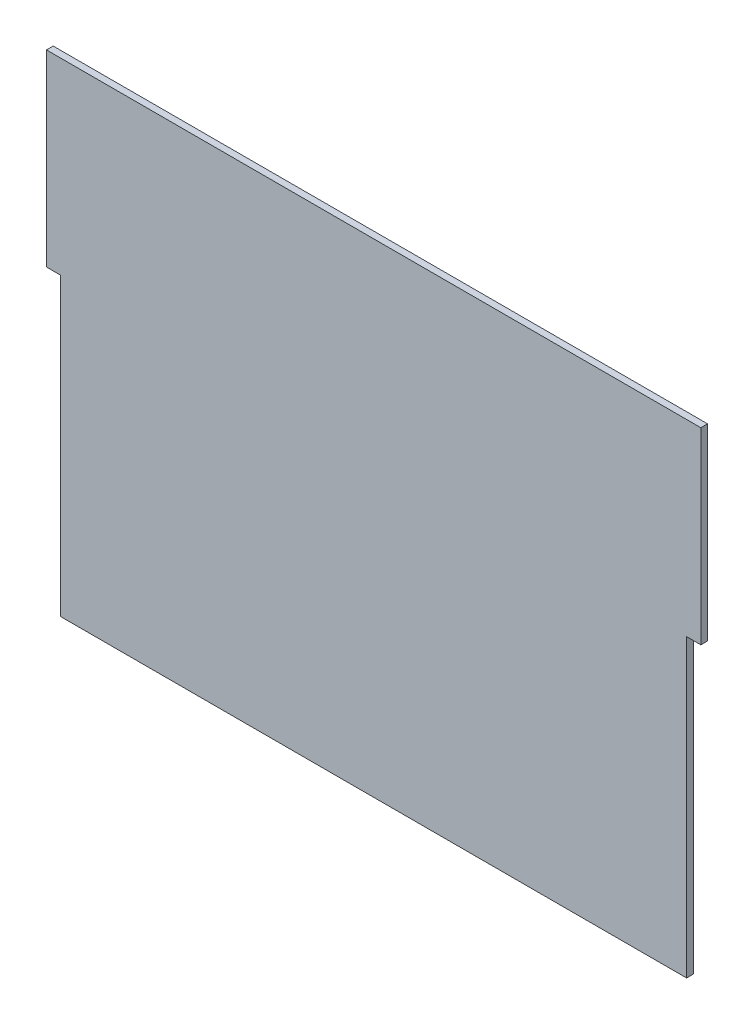
ISO-10303-21;
HEADER;
FILE_DESCRIPTION(('STEP AP214'),'2;1');
FILE_NAME('part.step','',(''),(''),'','','');
FILE_SCHEMA(('AUTOMOTIVE_DESIGN { 1 0 10303 214 1 1 1 1 }'));
ENDSEC;
DATA;
#1=APPLICATION_CONTEXT('core data for automotive mechanical design processes');
#2=APPLICATION_PROTOCOL_DEFINITION('international standard','automotive_design',2000,#1);
#3=PRODUCT_CONTEXT('',#1,'mechanical');
#4=PRODUCT('Part','Part','',(#3));
#5=PRODUCT_RELATED_PRODUCT_CATEGORY('part','',(#4));
#6=PRODUCT_DEFINITION_FORMATION('','',#4);
#7=PRODUCT_DEFINITION_CONTEXT('part definition',#1,'design');
#8=PRODUCT_DEFINITION('design','',#6,#7);
#9=PRODUCT_DEFINITION_SHAPE('','',#8);
#10=(LENGTH_UNIT() NAMED_UNIT(*) SI_UNIT(.MILLI.,.METRE.));
#11=(NAMED_UNIT(*) PLANE_ANGLE_UNIT() SI_UNIT($,.RADIAN.));
#12=(NAMED_UNIT(*) SI_UNIT($,.STERADIAN.) SOLID_ANGLE_UNIT());
#13=UNCERTAINTY_MEASURE_WITH_UNIT(LENGTH_MEASURE(1.E-05),#10,'distance_accuracy_value','');
#14=(GEOMETRIC_REPRESENTATION_CONTEXT(3) GLOBAL_UNCERTAINTY_ASSIGNED_CONTEXT((#13)) GLOBAL_UNIT_ASSIGNED_CONTEXT((#10,
#11,#12)) REPRESENTATION_CONTEXT('',''));
#15=CARTESIAN_POINT('',(0.,0.,0.));
#16=DIRECTION('',(0.,0.,1.));
#17=DIRECTION('',(1.,0.,0.));
#18=AXIS2_PLACEMENT_3D('',#15,#16,#17);
#19=CARTESIAN_POINT('',(139.7,0.,2.9972));
#20=DIRECTION('',(1.,0.,0.));
#21=DIRECTION('',(0.,1.,0.));
#22=AXIS2_PLACEMENT_3D('',#19,#20,#21);
#23=PLANE('',#22);
#24=DIRECTION('',(0.,-1.,0.));
#25=VECTOR('',#24,1.);
#26=CARTESIAN_POINT('',(139.7,0.,0.));
#27=LINE('',#26,#25);
#28=CARTESIAN_POINT('',(139.7,24.003,0.));
#29=VERTEX_POINT('',#28);
#30=CARTESIAN_POINT('',(139.7,-107.95,0.));
#31=VERTEX_POINT('',#30);
#32=EDGE_CURVE('E129',#29,#31,#27,.T.);
#33=ORIENTED_EDGE('',*,*,#32,.F.);
#34=DIRECTION('',(0.,0.,-1.));
#35=VECTOR('',#34,1.);
#36=CARTESIAN_POINT('',(139.7,24.003,2.9972));
#37=LINE('',#36,#35);
#38=CARTESIAN_POINT('',(139.7,24.003,2.9972));
#39=VERTEX_POINT('',#38);
#40=EDGE_CURVE('E11',#39,#29,#37,.T.);
#41=ORIENTED_EDGE('',*,*,#40,.F.);
#42=DIRECTION('',(0.,-1.,0.));
#43=VECTOR('',#42,1.);
#44=CARTESIAN_POINT('',(139.7,0.,2.9972));
#45=LINE('',#44,#43);
#46=CARTESIAN_POINT('',(139.7,-107.95,2.9972));
#47=VERTEX_POINT('',#46);
#48=EDGE_CURVE('E149',#39,#47,#45,.T.);
#49=ORIENTED_EDGE('',*,*,#48,.T.);
#50=DIRECTION('',(0.,0.,-1.));
#51=VECTOR('',#50,1.);
#52=CARTESIAN_POINT('',(139.7,-107.95,2.9972));
#53=LINE('',#52,#51);
#54=EDGE_CURVE('E52',#47,#31,#53,.T.);
#55=ORIENTED_EDGE('',*,*,#54,.T.);
#56=EDGE_LOOP('',(#33,#41,#49,#55));
#57=FACE_BOUND('',#56,.T.);
#58=ADVANCED_FACE('F36',(#57),#23,.T.);
#59=CARTESIAN_POINT('',(0.,24.0030000000001,2.9972));
#60=DIRECTION('',(0.,-1.,0.));
#61=DIRECTION('',(1.,0.,0.));
#62=AXIS2_PLACEMENT_3D('',#59,#60,#61);
#63=PLANE('',#62);
#64=DIRECTION('',(-1.,0.,0.));
#65=VECTOR('',#64,1.);
#66=CARTESIAN_POINT('',(0.,24.0030000000001,0.));
#67=LINE('',#66,#65);
#68=CARTESIAN_POINT('',(146.05,24.003,0.));
#69=VERTEX_POINT('',#68);
#70=EDGE_CURVE('E131',#69,#29,#67,.T.);
#71=ORIENTED_EDGE('',*,*,#70,.F.);
#72=DIRECTION('',(0.,0.,-1.));
#73=VECTOR('',#72,1.);
#74=CARTESIAN_POINT('',(146.05,24.003,2.9972));
#75=LINE('',#74,#73);
#76=CARTESIAN_POINT('',(146.05,24.003,2.9972));
#77=VERTEX_POINT('',#76);
#78=EDGE_CURVE('E44',#77,#69,#75,.T.);
#79=ORIENTED_EDGE('',*,*,#78,.F.);
#80=DIRECTION('',(-1.,0.,0.));
#81=VECTOR('',#80,1.);
#82=CARTESIAN_POINT('',(0.,24.0030000000001,2.9972));
#83=LINE('',#82,#81);
#84=EDGE_CURVE('E175',#77,#39,#83,.T.);
#85=ORIENTED_EDGE('',*,*,#84,.T.);
#86=ORIENTED_EDGE('',*,*,#40,.T.);
#87=EDGE_LOOP('',(#71,#79,#85,#86));
#88=FACE_BOUND('',#87,.T.);
#89=ADVANCED_FACE('F166',(#88),#63,.T.);
#90=CARTESIAN_POINT('',(146.05,0.,2.9972));
#91=DIRECTION('',(1.,0.,0.));
#92=DIRECTION('',(0.,0.,-1.));
#93=AXIS2_PLACEMENT_3D('',#90,#91,#92);
#94=PLANE('',#93);
#95=DIRECTION('',(0.,-1.,0.));
#96=VECTOR('',#95,1.);
#97=CARTESIAN_POINT('',(146.05,0.,0.));
#98=LINE('',#97,#96);
#99=CARTESIAN_POINT('',(146.05,107.95,0.));
#100=VERTEX_POINT('',#99);
#101=EDGE_CURVE('E134',#100,#69,#98,.T.);
#102=ORIENTED_EDGE('',*,*,#101,.F.);
#103=DIRECTION('',(0.,0.,-1.));
#104=VECTOR('',#103,1.);
#105=CARTESIAN_POINT('',(146.05,107.95,2.9972));
#106=LINE('',#105,#104);
#107=CARTESIAN_POINT('',(146.05,107.95,2.9972));
#108=VERTEX_POINT('',#107);
#109=EDGE_CURVE('E155',#108,#100,#106,.T.);
#110=ORIENTED_EDGE('',*,*,#109,.F.);
#111=DIRECTION('',(0.,-1.,0.));
#112=VECTOR('',#111,1.);
#113=CARTESIAN_POINT('',(146.05,0.,2.9972));
#114=LINE('',#113,#112);
#115=EDGE_CURVE('E162',#108,#77,#114,.T.);
#116=ORIENTED_EDGE('',*,*,#115,.T.);
#117=ORIENTED_EDGE('',*,*,#78,.T.);
#118=EDGE_LOOP('',(#102,#110,#116,#117));
#119=FACE_BOUND('',#118,.T.);
#120=ADVANCED_FACE('F160',(#119),#94,.T.);
#121=CARTESIAN_POINT('',(0.,107.95,2.9972));
#122=DIRECTION('',(0.,1.,0.));
#123=DIRECTION('',(-1.,0.,0.));
#124=AXIS2_PLACEMENT_3D('',#121,#122,#123);
#125=PLANE('',#124);
#126=DIRECTION('',(1.,0.,0.));
#127=VECTOR('',#126,1.);
#128=CARTESIAN_POINT('',(0.,107.95,0.));
#129=LINE('',#128,#127);
#130=CARTESIAN_POINT('',(-146.05,107.95,0.));
#131=VERTEX_POINT('',#130);
#132=EDGE_CURVE('E137',#131,#100,#129,.T.);
#133=ORIENTED_EDGE('',*,*,#132,.F.);
#134=DIRECTION('',(0.,0.,-1.));
#135=VECTOR('',#134,1.);
#136=CARTESIAN_POINT('',(-146.05,107.95,2.9972));
#137=LINE('',#136,#135);
#138=CARTESIAN_POINT('',(-146.05,107.95,2.9972));
#139=VERTEX_POINT('',#138);
#140=EDGE_CURVE('E153',#139,#131,#137,.T.);
#141=ORIENTED_EDGE('',*,*,#140,.F.);
#142=DIRECTION('',(1.,0.,0.));
#143=VECTOR('',#142,1.);
#144=CARTESIAN_POINT('',(0.,107.95,2.9972));
#145=LINE('',#144,#143);
#146=EDGE_CURVE('E174',#139,#108,#145,.T.);
#147=ORIENTED_EDGE('',*,*,#146,.T.);
#148=ORIENTED_EDGE('',*,*,#109,.T.);
#149=EDGE_LOOP('',(#133,#141,#147,#148));
#150=FACE_BOUND('',#149,.T.);
#151=ADVANCED_FACE('F172',(#150),#125,.T.);
#152=CARTESIAN_POINT('',(-146.05,0.,2.9972));
#153=DIRECTION('',(-1.,0.,0.));
#154=DIRECTION('',(0.,0.,1.));
#155=AXIS2_PLACEMENT_3D('',#152,#153,#154);
#156=PLANE('',#155);
#157=DIRECTION('',(0.,1.,0.));
#158=VECTOR('',#157,1.);
#159=CARTESIAN_POINT('',(-146.05,0.,0.));
#160=LINE('',#159,#158);
#161=CARTESIAN_POINT('',(-146.05,24.003,0.));
#162=VERTEX_POINT('',#161);
#163=EDGE_CURVE('E140',#162,#131,#160,.T.);
#164=ORIENTED_EDGE('',*,*,#163,.F.);
#165=DIRECTION('',(0.,0.,-1.));
#166=VECTOR('',#165,1.);
#167=CARTESIAN_POINT('',(-146.05,24.003,2.9972));
#168=LINE('',#167,#166);
#169=CARTESIAN_POINT('',(-146.05,24.003,2.9972));
#170=VERTEX_POINT('',#169);
#171=EDGE_CURVE('E121',#170,#162,#168,.T.);
#172=ORIENTED_EDGE('',*,*,#171,.F.);
#173=DIRECTION('',(0.,1.,0.));
#174=VECTOR('',#173,1.);
#175=CARTESIAN_POINT('',(-146.05,0.,2.9972));
#176=LINE('',#175,#174);
#177=EDGE_CURVE('E111',#170,#139,#176,.T.);
#178=ORIENTED_EDGE('',*,*,#177,.T.);
#179=ORIENTED_EDGE('',*,*,#140,.T.);
#180=EDGE_LOOP('',(#164,#172,#178,#179));
#181=FACE_BOUND('',#180,.T.);
#182=ADVANCED_FACE('F181',(#181),#156,.T.);
#183=CARTESIAN_POINT('',(0.,24.003,2.9972));
#184=DIRECTION('',(0.,1.,0.));
#185=DIRECTION('',(-1.,0.,0.));
#186=AXIS2_PLACEMENT_3D('',#183,#184,#185);
#187=PLANE('',#186);
#188=DIRECTION('',(1.,0.,0.));
#189=VECTOR('',#188,1.);
#190=CARTESIAN_POINT('',(0.,24.003,0.));
#191=LINE('',#190,#189);
#192=CARTESIAN_POINT('',(-139.7,24.003,0.));
#193=VERTEX_POINT('',#192);
#194=EDGE_CURVE('E118',#162,#193,#191,.T.);
#195=ORIENTED_EDGE('',*,*,#194,.T.);
#196=DIRECTION('',(0.,0.,-1.));
#197=VECTOR('',#196,1.);
#198=CARTESIAN_POINT('',(-139.7,24.003,2.9972));
#199=LINE('',#198,#197);
#200=CARTESIAN_POINT('',(-139.7,24.003,2.9972));
#201=VERTEX_POINT('',#200);
#202=EDGE_CURVE('E115',#201,#193,#199,.T.);
#203=ORIENTED_EDGE('',*,*,#202,.F.);
#204=DIRECTION('',(1.,0.,0.));
#205=VECTOR('',#204,1.);
#206=CARTESIAN_POINT('',(0.,24.003,2.9972));
#207=LINE('',#206,#205);
#208=EDGE_CURVE('E103',#170,#201,#207,.T.);
#209=ORIENTED_EDGE('',*,*,#208,.F.);
#210=ORIENTED_EDGE('',*,*,#171,.T.);
#211=EDGE_LOOP('',(#195,#203,#209,#210));
#212=FACE_BOUND('',#211,.T.);
#213=ADVANCED_FACE('F116',(#212),#187,.F.);
#214=CARTESIAN_POINT('',(-139.7,0.,2.9972));
#215=DIRECTION('',(-1.,0.,0.));
#216=DIRECTION('',(0.,-1.,0.));
#217=AXIS2_PLACEMENT_3D('',#214,#215,#216);
#218=PLANE('',#217);
#219=DIRECTION('',(0.,1.,0.));
#220=VECTOR('',#219,1.);
#221=CARTESIAN_POINT('',(-139.7,0.,0.));
#222=LINE('',#221,#220);
#223=CARTESIAN_POINT('',(-139.7,-107.95,0.));
#224=VERTEX_POINT('',#223);
#225=EDGE_CURVE('E144',#224,#193,#222,.T.);
#226=ORIENTED_EDGE('',*,*,#225,.F.);
#227=DIRECTION('',(0.,0.,-1.));
#228=VECTOR('',#227,1.);
#229=CARTESIAN_POINT('',(-139.7,-107.95,2.9972));
#230=LINE('',#229,#228);
#231=CARTESIAN_POINT('',(-139.7,-107.95,2.9972));
#232=VERTEX_POINT('',#231);
#233=EDGE_CURVE('E77',#232,#224,#230,.T.);
#234=ORIENTED_EDGE('',*,*,#233,.F.);
#235=DIRECTION('',(0.,1.,0.));
#236=VECTOR('',#235,1.);
#237=CARTESIAN_POINT('',(-139.7,0.,2.9972));
#238=LINE('',#237,#236);
#239=EDGE_CURVE('E108',#232,#201,#238,.T.);
#240=ORIENTED_EDGE('',*,*,#239,.T.);
#241=ORIENTED_EDGE('',*,*,#202,.T.);
#242=EDGE_LOOP('',(#226,#234,#240,#241));
#243=FACE_BOUND('',#242,.T.);
#244=ADVANCED_FACE('F123',(#243),#218,.T.);
#245=CARTESIAN_POINT('',(0.,-107.95,2.9972));
#246=DIRECTION('',(0.,-1.,0.));
#247=DIRECTION('',(1.,0.,0.));
#248=AXIS2_PLACEMENT_3D('',#245,#246,#247);
#249=PLANE('',#248);
#250=DIRECTION('',(-1.,0.,0.));
#251=VECTOR('',#250,1.);
#252=CARTESIAN_POINT('',(0.,-107.95,0.));
#253=LINE('',#252,#251);
#254=EDGE_CURVE('E146',#31,#224,#253,.T.);
#255=ORIENTED_EDGE('',*,*,#254,.F.);
#256=ORIENTED_EDGE('',*,*,#54,.F.);
#257=DIRECTION('',(-1.,0.,0.));
#258=VECTOR('',#257,1.);
#259=CARTESIAN_POINT('',(0.,-107.95,2.9972));
#260=LINE('',#259,#258);
#261=EDGE_CURVE('E124',#47,#232,#260,.T.);
#262=ORIENTED_EDGE('',*,*,#261,.T.);
#263=ORIENTED_EDGE('',*,*,#233,.T.);
#264=EDGE_LOOP('',(#255,#256,#262,#263));
#265=FACE_BOUND('',#264,.T.);
#266=ADVANCED_FACE('F182',(#265),#249,.T.);
#267=CARTESIAN_POINT('',(0.,0.,2.9972));
#268=DIRECTION('',(0.,0.,1.));
#269=DIRECTION('',(1.,0.,0.));
#270=AXIS2_PLACEMENT_3D('',#267,#268,#269);
#271=PLANE('',#270);
#272=ORIENTED_EDGE('',*,*,#48,.F.);
#273=ORIENTED_EDGE('',*,*,#84,.F.);
#274=ORIENTED_EDGE('',*,*,#115,.F.);
#275=ORIENTED_EDGE('',*,*,#146,.F.);
#276=ORIENTED_EDGE('',*,*,#177,.F.);
#277=ORIENTED_EDGE('',*,*,#208,.T.);
#278=ORIENTED_EDGE('',*,*,#239,.F.);
#279=ORIENTED_EDGE('',*,*,#261,.F.);
#280=EDGE_LOOP('',(#272,#273,#274,#275,#276,#277,#278,#279));
#281=FACE_BOUND('',#280,.T.);
#282=ADVANCED_FACE('F105',(#281),#271,.T.);
#283=CARTESIAN_POINT('',(0.,0.,0.));
#284=DIRECTION('',(0.,0.,1.));
#285=DIRECTION('',(1.,0.,0.));
#286=AXIS2_PLACEMENT_3D('',#283,#284,#285);
#287=PLANE('',#286);
#288=ORIENTED_EDGE('',*,*,#32,.T.);
#289=ORIENTED_EDGE('',*,*,#254,.T.);
#290=ORIENTED_EDGE('',*,*,#225,.T.);
#291=ORIENTED_EDGE('',*,*,#194,.F.);
#292=ORIENTED_EDGE('',*,*,#163,.T.);
#293=ORIENTED_EDGE('',*,*,#132,.T.);
#294=ORIENTED_EDGE('',*,*,#101,.T.);
#295=ORIENTED_EDGE('',*,*,#70,.T.);
#296=EDGE_LOOP('',(#288,#289,#290,#291,#292,#293,#294,#295));
#297=FACE_BOUND('',#296,.T.);
#298=ADVANCED_FACE('F168',(#297),#287,.F.);
#299=CLOSED_SHELL('',(#58,#89,#120,#151,#182,#213,#244,#266,#282,#298));
#300=MANIFOLD_SOLID_BREP('B2',#299);
#301=ADVANCED_BREP_SHAPE_REPRESENTATION('',(#18,#300),#14);
#302=SHAPE_DEFINITION_REPRESENTATION(#9,#301);
ENDSEC;
END-ISO-10303-21;
